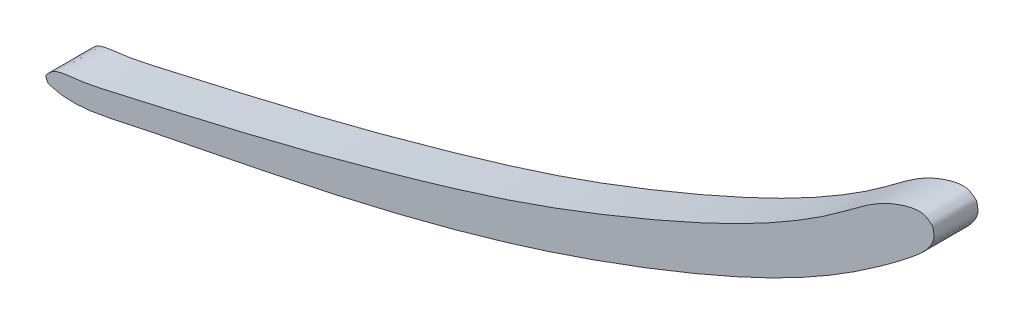
ISO-10303-21;
HEADER;
FILE_DESCRIPTION(('STEP AP214'),'2;1');
FILE_NAME('part.step','',(''),(''),'','','');
FILE_SCHEMA(('AUTOMOTIVE_DESIGN { 1 0 10303 214 1 1 1 1 }'));
ENDSEC;
DATA;
#1=APPLICATION_CONTEXT('core data for automotive mechanical design processes');
#2=APPLICATION_PROTOCOL_DEFINITION('international standard','automotive_design',2000,#1);
#3=PRODUCT_CONTEXT('',#1,'mechanical');
#4=PRODUCT('Part','Part','',(#3));
#5=PRODUCT_RELATED_PRODUCT_CATEGORY('part','',(#4));
#6=PRODUCT_DEFINITION_FORMATION('','',#4);
#7=PRODUCT_DEFINITION_CONTEXT('part definition',#1,'design');
#8=PRODUCT_DEFINITION('design','',#6,#7);
#9=PRODUCT_DEFINITION_SHAPE('','',#8);
#10=(LENGTH_UNIT() NAMED_UNIT(*) SI_UNIT(.MILLI.,.METRE.));
#11=(NAMED_UNIT(*) PLANE_ANGLE_UNIT() SI_UNIT($,.RADIAN.));
#12=(NAMED_UNIT(*) SI_UNIT($,.STERADIAN.) SOLID_ANGLE_UNIT());
#13=UNCERTAINTY_MEASURE_WITH_UNIT(LENGTH_MEASURE(1.E-05),#10,'distance_accuracy_value','');
#14=(GEOMETRIC_REPRESENTATION_CONTEXT(3) GLOBAL_UNCERTAINTY_ASSIGNED_CONTEXT((#13)) GLOBAL_UNIT_ASSIGNED_CONTEXT((#10,
#11,#12)) REPRESENTATION_CONTEXT('',''));
#15=CARTESIAN_POINT('',(0.,0.,0.));
#16=DIRECTION('',(0.,0.,1.));
#17=DIRECTION('',(1.,0.,0.));
#18=AXIS2_PLACEMENT_3D('',#15,#16,#17);
#19=CARTESIAN_POINT('',(93.8605540569844,0.,244.));
#20=CARTESIAN_POINT('',(93.8086791374924,0.104371023125291,244.));
#21=CARTESIAN_POINT('',(93.7224281105917,0.182551689222101,244.));
#22=CARTESIAN_POINT('',(93.5443834962592,0.328023369445167,244.));
#23=CARTESIAN_POINT('',(93.4510612065642,0.395126938248988,244.));
#24=CARTESIAN_POINT('',(93.2673724269745,0.533205688426143,244.));
#25=CARTESIAN_POINT('',(93.1767269560878,0.603815450492115,244.));
#26=CARTESIAN_POINT('',(92.9904425509646,0.738494357269943,244.));
#27=CARTESIAN_POINT('',(92.8950004810606,0.802614303495659,244.));
#28=CARTESIAN_POINT('',(92.6996064816065,0.920618631459439,244.));
#29=CARTESIAN_POINT('',(92.5993833129429,0.974506288392161,244.));
#30=CARTESIAN_POINT('',(92.3894918795378,1.06315896569431,244.));
#31=CARTESIAN_POINT('',(92.2791971709696,1.09851559198404,244.));
#32=CARTESIAN_POINT('',(91.9422006645801,1.17918113296887,244.));
#33=CARTESIAN_POINT('',(91.714825315123,1.19886813501814,244.));
#34=CARTESIAN_POINT('',(91.257409096839,1.20472416603272,244.));
#35=CARTESIAN_POINT('',(91.0267978015796,1.18991753782417,244.));
#36=CARTESIAN_POINT('',(90.5723191315177,1.14334518684298,244.));
#37=CARTESIAN_POINT('',(90.3470905185304,1.11111293580452,244.));
#38=CARTESIAN_POINT('',(89.6768006079999,0.99040869565579,244.));
#39=CARTESIAN_POINT('',(89.2367468012532,0.879657450637902,244.));
#40=CARTESIAN_POINT('',(88.3630772807734,0.629510689922901,244.));
#41=CARTESIAN_POINT('',(87.9286589973189,0.487991250829142,244.));
#42=CARTESIAN_POINT('',(87.0722296775301,0.178624810143415,244.));
#43=CARTESIAN_POINT('',(86.6508450465993,0.0116247730714919,244.));
#44=CARTESIAN_POINT('',(85.4056681441988,-0.523597171459055,244.));
#45=CARTESIAN_POINT('',(84.6014954480775,-0.927199706899777,244.));
#46=CARTESIAN_POINT('',(82.2641120259531,-2.27350013748435,244.));
#47=CARTESIAN_POINT('',(80.8004762480953,-3.34188406931883,244.));
#48=CARTESIAN_POINT('',(78.6196084356311,-4.96990224430101,244.));
#49=CARTESIAN_POINT('',(77.894138396885,-5.5151936531122,244.));
#50=CARTESIAN_POINT('',(76.4329174622362,-6.5876579317648,244.));
#51=CARTESIAN_POINT('',(75.6981806124208,-7.1166179126681,244.));
#52=CARTESIAN_POINT('',(73.4718001048386,-8.66442647793136,244.));
#53=CARTESIAN_POINT('',(71.9582511141489,-9.64467004889984,244.));
#54=CARTESIAN_POINT('',(68.8919897706839,-11.5361373716413,244.));
#55=CARTESIAN_POINT('',(67.3395127582724,-12.4477758771147,244.));
#56=CARTESIAN_POINT('',(64.2056538003671,-14.2201120814259,244.));
#57=CARTESIAN_POINT('',(62.6237737046291,-15.0799318617714,244.));
#58=CARTESIAN_POINT('',(59.4304687387369,-16.7475029870733,244.));
#59=CARTESIAN_POINT('',(57.8193963845281,-17.5558755909184,244.));
#60=CARTESIAN_POINT('',(54.574228193873,-19.1320452071202,244.));
#61=CARTESIAN_POINT('',(52.9402496624787,-19.9000489528382,244.));
#62=CARTESIAN_POINT('',(49.6563406051193,-21.4079433374709,244.));
#63=CARTESIAN_POINT('',(48.0059001632993,-22.1478013158492,244.));
#64=CARTESIAN_POINT('',(43.0356104304303,-24.3278315909944,244.));
#65=CARTESIAN_POINT('',(39.6993773155864,-25.7292600006737,244.));
#66=CARTESIAN_POINT('',(32.9930199195047,-28.4459399125709,244.));
#67=CARTESIAN_POINT('',(29.6232129384999,-29.7608437866351,244.));
#68=CARTESIAN_POINT('',(22.8413356340426,-32.2802520420894,244.));
#69=CARTESIAN_POINT('',(19.4267004740063,-33.4807706913742,244.));
#70=CARTESIAN_POINT('',(12.5595327127389,-35.7579846274792,244.));
#71=CARTESIAN_POINT('',(9.10665488269142,-36.8360789365154,244.));
#72=CARTESIAN_POINT('',(2.1758102595807,-38.9135796804014,244.));
#73=CARTESIAN_POINT('',(-1.30083218836211,-39.9164155500527,244.));
#74=CARTESIAN_POINT('',(-8.26539828335414,-41.8785611767772,244.));
#75=CARTESIAN_POINT('',(-11.7541409427858,-42.83653356265,244.));
#76=CARTESIAN_POINT('',(-18.7474275530531,-44.6959708243549,244.));
#77=CARTESIAN_POINT('',(-22.2514074112569,-45.5965908548554,244.));
#78=CARTESIAN_POINT('',(-29.2734558642128,-47.3415504678066,244.));
#79=CARTESIAN_POINT('',(-32.7915270610276,-48.1862340243107,244.));
#80=CARTESIAN_POINT('',(-39.8343566852922,-49.8474570856738,244.));
#81=CARTESIAN_POINT('',(-43.3588774014795,-50.6648724095137,244.));
#82=CARTESIAN_POINT('',(-48.6466114694081,-51.8867792112173,244.));
#83=CARTESIAN_POINT('',(-50.4095254910097,-52.2926265569602,244.));
#84=CARTESIAN_POINT('',(-53.0555067456765,-52.8943669274234,244.));
#85=CARTESIAN_POINT('',(-53.9377671329339,-53.0937623562211,244.));
#86=CARTESIAN_POINT('',(-55.7027865659835,-53.4903376135999,244.));
#87=CARTESIAN_POINT('',(-56.5850919298664,-53.6899882338138,244.));
#88=CARTESIAN_POINT('',(-58.3530400916118,-54.0720829512819,244.));
#89=CARTESIAN_POINT('',(-59.239187916362,-54.2516568759817,244.));
#90=CARTESIAN_POINT('',(-60.5762141506463,-54.4798241411653,244.));
#91=CARTESIAN_POINT('',(-61.0231386194551,-54.5493008888079,244.));
#92=CARTESIAN_POINT('',(-61.9196636445407,-54.6740706940748,244.));
#93=CARTESIAN_POINT('',(-62.3697209247039,-54.7268499625822,244.));
#94=CARTESIAN_POINT('',(-63.2707635620614,-54.827441411768,244.));
#95=CARTESIAN_POINT('',(-63.7211334340201,-54.8785476823985,244.));
#96=CARTESIAN_POINT('',(-64.3910076218556,-54.9856098868437,244.));
#97=CARTESIAN_POINT('',(-64.6133801142198,-55.0262152796553,244.));
#98=CARTESIAN_POINT('',(-65.055143030759,-55.1233861570706,244.));
#99=CARTESIAN_POINT('',(-65.2744793731547,-55.180241088496,244.));
#100=CARTESIAN_POINT('',(-65.5991706994857,-55.2886077547582,244.));
#101=CARTESIAN_POINT('',(-65.7066759953326,-55.3286109749291,244.));
#102=CARTESIAN_POINT('',(-65.9197572623547,-55.4189432015715,244.));
#103=CARTESIAN_POINT('',(-66.0261870965575,-55.4697772025274,244.));
#104=CARTESIAN_POINT('',(-66.3333127779153,-55.6378940397056,244.));
#105=CARTESIAN_POINT('',(-66.5203714127066,-55.7734439951672,244.));
#106=CARTESIAN_POINT('',(-66.8728940754668,-56.0731938702789,244.));
#107=CARTESIAN_POINT('',(-67.0383208032983,-56.2382814343258,244.));
#108=CARTESIAN_POINT('',(-67.2803413686867,-56.4907051810745,244.));
#109=CARTESIAN_POINT('',(-67.360273103681,-56.5767179163651,244.));
#110=CARTESIAN_POINT('',(-67.4549413420323,-56.7233693286972,244.));
#111=CARTESIAN_POINT('',(-67.4816210284276,-56.7762719237132,244.));
#112=CARTESIAN_POINT('',(-67.5140270938976,-56.8874267094301,244.));
#113=CARTESIAN_POINT('',(-67.519504630759,-56.9468099496123,244.));
#114=CARTESIAN_POINT('',(-67.5138245365627,-57.1205303650839,244.));
#115=CARTESIAN_POINT('',(-67.4826059788027,-57.2347260411175,244.));
#116=CARTESIAN_POINT('',(-67.4121359120193,-57.4555009410977,244.));
#117=CARTESIAN_POINT('',(-67.3717384764746,-57.564854992586,244.));
#118=CARTESIAN_POINT('',(-67.2906182186022,-57.7196552061633,244.));
#119=CARTESIAN_POINT('',(-67.2599502122451,-57.7688557724819,244.));
#120=CARTESIAN_POINT('',(-67.1843737133585,-57.8578382541536,244.));
#121=CARTESIAN_POINT('',(-67.1402626378147,-57.8967760250752,244.));
#122=CARTESIAN_POINT('',(-67.0419802643099,-57.9590083217347,244.));
#123=CARTESIAN_POINT('',(-66.9871980158439,-57.9815622036811,244.));
#124=CARTESIAN_POINT('',(-66.8769453565659,-58.0163227281835,244.));
#125=CARTESIAN_POINT('',(-66.8205775584039,-58.029426526502,244.));
#126=CARTESIAN_POINT('',(-66.650400097719,-58.0650381052503,244.));
#127=CARTESIAN_POINT('',(-66.5360715003173,-58.0856059033205,244.));
#128=CARTESIAN_POINT('',(-66.3096446199086,-58.1358671929452,244.));
#129=CARTESIAN_POINT('',(-66.1970180134791,-58.1635409483073,244.));
#130=CARTESIAN_POINT('',(-65.8595841654729,-58.2484948813967,244.));
#131=CARTESIAN_POINT('',(-65.6356485721547,-58.3095524454584,244.));
#132=CARTESIAN_POINT('',(-64.9579051687279,-58.4669981082381,244.));
#133=CARTESIAN_POINT('',(-64.4977928274511,-58.5307223184949,244.));
#134=CARTESIAN_POINT('',(-63.5832872386379,-58.6049190713349,244.));
#135=CARTESIAN_POINT('',(-63.1260518618479,-58.6190858099251,244.));
#136=CARTESIAN_POINT('',(-61.7543764058126,-58.6212008946451,244.));
#137=CARTESIAN_POINT('',(-60.8399741117111,-58.5594021799264,244.));
#138=CARTESIAN_POINT('',(-59.011237678737,-58.3460731268619,244.));
#139=CARTESIAN_POINT('',(-58.1034332960804,-58.1983011054739,244.));
#140=CARTESIAN_POINT('',(-56.2942398205783,-57.8707121697664,244.));
#141=CARTESIAN_POINT('',(-55.392897855504,-57.6885931028364,244.));
#142=CARTESIAN_POINT('',(-53.5919407800195,-57.3146326557679,244.));
#143=CARTESIAN_POINT('',(-52.6924959490929,-57.1224087886931,244.));
#144=CARTESIAN_POINT('',(-49.9946234271937,-56.5439722435562,244.));
#145=CARTESIAN_POINT('',(-48.1957773410412,-56.1596070566092,244.));
#146=CARTESIAN_POINT('',(-42.7931189994041,-55.0356571930698,244.));
#147=CARTESIAN_POINT('',(-39.1841954075797,-54.3206824403801,244.));
#148=CARTESIAN_POINT('',(-31.9666590390561,-52.8901306174075,244.));
#149=CARTESIAN_POINT('',(-28.3585295809253,-52.1717655145319,244.));
#150=CARTESIAN_POINT('',(-21.1528786400058,-50.6837299613315,244.));
#151=CARTESIAN_POINT('',(-17.554778064472,-49.9160463984074,244.));
#152=CARTESIAN_POINT('',(-10.3746160473152,-48.3065361313304,244.));
#153=CARTESIAN_POINT('',(-6.79333063695175,-47.4662260990448,244.));
#154=CARTESIAN_POINT('',(3.9192137548619,-44.8187225448935,244.));
#155=CARTESIAN_POINT('',(11.0223392878237,-42.8836129281505,244.));
#156=CARTESIAN_POINT('',(25.0890544185601,-38.5776042210642,244.));
#157=CARTESIAN_POINT('',(32.0556065834265,-36.1978043404435,244.));
#158=CARTESIAN_POINT('',(42.3912526645422,-32.3223696736165,244.));
#159=CARTESIAN_POINT('',(45.8158420581117,-30.9810729909033,244.));
#160=CARTESIAN_POINT('',(52.6089835127207,-28.191367401419,244.));
#161=CARTESIAN_POINT('',(55.9792691796525,-26.7431819441462,244.));
#162=CARTESIAN_POINT('',(62.6442371087069,-23.6934109301642,244.));
#163=CARTESIAN_POINT('',(65.9384768785694,-22.0909275520295,244.));
#164=CARTESIAN_POINT('',(72.4088633457205,-18.6463487158374,244.));
#165=CARTESIAN_POINT('',(75.5845213553748,-16.8032617054568,244.));
#166=CARTESIAN_POINT('',(80.2386777400822,-13.8167981980902,244.));
#167=CARTESIAN_POINT('',(81.7738828152785,-12.7841420823869,244.));
#168=CARTESIAN_POINT('',(84.8027433080683,-10.6570921754283,244.));
#169=CARTESIAN_POINT('',(86.2958264049976,-9.56320551191692,244.));
#170=CARTESIAN_POINT('',(88.5065254383957,-7.88430136121495,244.));
#171=CARTESIAN_POINT('',(89.2388903474007,-7.31842609918318,244.));
#172=CARTESIAN_POINT('',(90.3193553140982,-6.44716810348386,244.));
#173=CARTESIAN_POINT('',(90.6756304962373,-6.15218378749594,244.));
#174=CARTESIAN_POINT('',(91.3742524810901,-5.54582701188665,244.));
#175=CARTESIAN_POINT('',(91.7181421495188,-5.23465487872439,244.));
#176=CARTESIAN_POINT('',(92.37429189152,-4.58549341756893,244.));
#177=CARTESIAN_POINT('',(92.6864195851706,-4.24735196642919,244.));
#178=CARTESIAN_POINT('',(93.1138919046858,-3.7055141023747,244.));
#179=CARTESIAN_POINT('',(93.2494060471225,-3.51896888632089,244.));
#180=CARTESIAN_POINT('',(93.501311052493,-3.12961692755714,244.));
#181=CARTESIAN_POINT('',(93.6174857772522,-2.92615699043442,244.));
#182=CARTESIAN_POINT('',(93.8220788940639,-2.50939305326026,244.));
#183=CARTESIAN_POINT('',(93.9117701194868,-2.29535189710122,244.));
#184=CARTESIAN_POINT('',(94.0461015785027,-1.84704385862286,244.));
#185=CARTESIAN_POINT('',(94.0895697788212,-1.61917803752574,244.));
#186=CARTESIAN_POINT('',(94.0910725309282,-1.27067426780246,244.));
#187=CARTESIAN_POINT('',(94.0795016405934,-1.15264197988017,244.));
#188=CARTESIAN_POINT('',(94.04430288288,-0.920534515574776,244.));
#189=CARTESIAN_POINT('',(94.0204552340993,-0.805629278577837,244.));
#190=CARTESIAN_POINT('',(93.9751132842204,-0.575386235497547,244.));
#191=CARTESIAN_POINT('',(93.9572079337126,-0.459388744026412,244.));
#192=CARTESIAN_POINT('',(93.9330463257599,-0.284896877976952,244.));
#193=CARTESIAN_POINT('',(93.9255371178367,-0.226632808358534,244.));
#194=CARTESIAN_POINT('',(93.9086434400924,-0.140271530170307,244.));
#195=CARTESIAN_POINT('',(93.9019509773415,-0.111679503496059,244.));
#196=CARTESIAN_POINT('',(93.8846917055139,-0.0552075941555424,244.));
#197=CARTESIAN_POINT('',(93.8735227868573,-0.0260927557813124,244.));
#198=CARTESIAN_POINT('',(93.8605540569844,0.,244.));
#199=B_SPLINE_CURVE_WITH_KNOTS('',3,(#19,#20,#21,#22,#23,#24,#25,#26,#27,#28,#29,#30,#31,#32,
#33,#34,#35,#36,#37,#38,#39,#40,#41,#42,#43,#44,#45,#46,#47,#48,#49,#50,#51,#52,#53,#54,#55,#56,
#57,#58,#59,#60,#61,#62,#63,#64,#65,#66,#67,#68,#69,#70,#71,#72,#73,#74,#75,#76,#77,#78,#79,#80,
#81,#82,#83,#84,#85,#86,#87,#88,#89,#90,#91,#92,#93,#94,#95,#96,#97,#98,#99,#100,#101,#102,#103,
#104,#105,#106,#107,#108,#109,#110,#111,#112,#113,#114,#115,#116,#117,#118,#119,#120,#121,#122,
#123,#124,#125,#126,#127,#128,#129,#130,#131,#132,#133,#134,#135,#136,#137,#138,#139,#140,#141,
#142,#143,#144,#145,#146,#147,#148,#149,#150,#151,#152,#153,#154,#155,#156,#157,#158,#159,#160,
#161,#162,#163,#164,#165,#166,#167,#168,#169,#170,#171,#172,#173,#174,#175,#176,#177,#178,#179,
#180,#181,#182,#183,#184,#185,#186,#187,#188,#189,#190,#191,#192,#193,#194,#195,#196,#197,#198),
.UNSPECIFIED.,.T.,.F.,(4,2,2,2,2,2,2,2,2,2,2,2,2,2,2,2,2,2,2,2,2,2,2,2,2,2,2,2,2,2,2,2,2,2,2,2,
2,2,2,2,2,2,2,2,2,2,2,2,2,2,2,2,2,2,2,2,2,2,2,2,2,2,2,2,2,2,2,2,2,2,2,2,2,2,2,2,2,2,2,2,2,2,2,2,
2,2,2,2,2,4),(0.,0.000976562499999856,0.00195312499999971,0.00292968749999957,
0.00390624999999942,0.00488281249999928,0.00585937499999913,0.00781249999999896,
0.00976562499999879,0.0117187499999986,0.0156249999999984,0.0195312499999982,0.0234374999999979,
0.0312499999999973,0.0468749999999961,0.0546874999999955,0.0624999999999949,0.0781249999999936,
0.0937499999999923,0.109374999999991,0.12499999999999,0.140624999999989,0.156249999999987,
0.187499999999985,0.218749999999982,0.24999999999998,0.281249999999977,0.312499999999975,
0.343749999999972,0.37499999999997,0.406249999999967,0.437499999999965,0.453124999999964,
0.460937499999963,0.468749999999962,0.476562499999962,0.480468749999962,0.484374999999961,
0.488281249999961,0.490234374999961,0.492187499999961,0.49316406249996,0.49414062499996,
0.49609374999996,0.49804687499996,0.49902343749996,0.49951171874996,0.499999999999959,
0.500976562499959,0.501953124999959,0.502441406249959,0.502929687499959,0.503417968749959,
0.503906249999959,0.504882812499959,0.505859374999959,0.507812499999959,0.511718749999959,
0.51562499999996,0.52343749999996,0.531249999999961,0.539062499999962,0.546874999999962,
0.562499999999964,0.593749999999966,0.624999999999969,0.656249999999971,0.687499999999974,
0.749999999999979,0.812499999999984,0.843749999999987,0.87499999999999,0.906249999999992,
0.937499999999995,0.953124999999996,0.968749999999998,0.976562499999998,0.980468749999998,
0.984374999999999,0.988281249999999,0.990234374999999,0.992187499999999,0.994140625,0.99609375,
0.9970703125,0.998046875,0.9990234375,0.99951171875,0.999755859375,1.),.UNSPECIFIED.);
#200=DIRECTION('',(0.,0.,-1.));
#201=VECTOR('',#200,1.);
#202=SURFACE_OF_LINEAR_EXTRUSION('',#199,#201);
#203=CARTESIAN_POINT('',(93.8605540569844,0.,244.));
#204=CARTESIAN_POINT('',(93.8735227868573,-0.0260927557813124,244.));
#205=CARTESIAN_POINT('',(93.8846917055139,-0.0552075941555424,244.));
#206=CARTESIAN_POINT('',(93.9019509773415,-0.111679503496059,244.));
#207=CARTESIAN_POINT('',(93.9086434400924,-0.140271530170307,244.));
#208=CARTESIAN_POINT('',(93.9255371178367,-0.226632808358534,244.));
#209=CARTESIAN_POINT('',(93.9330463257599,-0.284896877976952,244.));
#210=CARTESIAN_POINT('',(93.9572079337126,-0.459388744026412,244.));
#211=CARTESIAN_POINT('',(93.9751132842204,-0.575386235497547,244.));
#212=CARTESIAN_POINT('',(94.0204552340993,-0.805629278577837,244.));
#213=CARTESIAN_POINT('',(94.04430288288,-0.920534515574776,244.));
#214=CARTESIAN_POINT('',(94.0795016405934,-1.15264197988017,244.));
#215=CARTESIAN_POINT('',(94.0910725309282,-1.27067426780246,244.));
#216=CARTESIAN_POINT('',(94.0895697788212,-1.61917803752574,244.));
#217=CARTESIAN_POINT('',(94.0461015785027,-1.84704385862286,244.));
#218=CARTESIAN_POINT('',(93.9117701194868,-2.29535189710122,244.));
#219=CARTESIAN_POINT('',(93.8220788940639,-2.50939305326026,244.));
#220=CARTESIAN_POINT('',(93.6174857772522,-2.92615699043442,244.));
#221=CARTESIAN_POINT('',(93.501311052493,-3.12961692755714,244.));
#222=CARTESIAN_POINT('',(93.2494060471225,-3.51896888632089,244.));
#223=CARTESIAN_POINT('',(93.1138919046858,-3.7055141023747,244.));
#224=CARTESIAN_POINT('',(92.6864195851706,-4.24735196642919,244.));
#225=CARTESIAN_POINT('',(92.37429189152,-4.58549341756893,244.));
#226=CARTESIAN_POINT('',(91.7181421495188,-5.23465487872439,244.));
#227=CARTESIAN_POINT('',(91.3742524810901,-5.54582701188665,244.));
#228=CARTESIAN_POINT('',(90.6756304962373,-6.15218378749594,244.));
#229=CARTESIAN_POINT('',(90.3193553140982,-6.44716810348386,244.));
#230=CARTESIAN_POINT('',(89.2388903474007,-7.31842609918318,244.));
#231=CARTESIAN_POINT('',(88.5065254383957,-7.88430136121495,244.));
#232=CARTESIAN_POINT('',(86.2958264049976,-9.56320551191692,244.));
#233=CARTESIAN_POINT('',(84.8027433080683,-10.6570921754283,244.));
#234=CARTESIAN_POINT('',(81.7738828152785,-12.7841420823869,244.));
#235=CARTESIAN_POINT('',(80.2386777400822,-13.8167981980902,244.));
#236=CARTESIAN_POINT('',(75.5845213553748,-16.8032617054568,244.));
#237=CARTESIAN_POINT('',(72.4088633457205,-18.6463487158374,244.));
#238=CARTESIAN_POINT('',(65.9384768785694,-22.0909275520295,244.));
#239=CARTESIAN_POINT('',(62.6442371087069,-23.6934109301642,244.));
#240=CARTESIAN_POINT('',(55.9792691796525,-26.7431819441462,244.));
#241=CARTESIAN_POINT('',(52.6089835127207,-28.191367401419,244.));
#242=CARTESIAN_POINT('',(45.8158420581117,-30.9810729909033,244.));
#243=CARTESIAN_POINT('',(42.3912526645422,-32.3223696736165,244.));
#244=CARTESIAN_POINT('',(32.0556065834265,-36.1978043404435,244.));
#245=CARTESIAN_POINT('',(25.0890544185601,-38.5776042210642,244.));
#246=CARTESIAN_POINT('',(11.0223392878237,-42.8836129281505,244.));
#247=CARTESIAN_POINT('',(3.9192137548619,-44.8187225448935,244.));
#248=CARTESIAN_POINT('',(-6.79333063695175,-47.4662260990448,244.));
#249=CARTESIAN_POINT('',(-10.3746160473152,-48.3065361313304,244.));
#250=CARTESIAN_POINT('',(-17.554778064472,-49.9160463984074,244.));
#251=CARTESIAN_POINT('',(-21.1528786400058,-50.6837299613315,244.));
#252=CARTESIAN_POINT('',(-28.3585295809253,-52.1717655145319,244.));
#253=CARTESIAN_POINT('',(-31.9666590390561,-52.8901306174075,244.));
#254=CARTESIAN_POINT('',(-39.1841954075797,-54.3206824403801,244.));
#255=CARTESIAN_POINT('',(-42.7931189994041,-55.0356571930698,244.));
#256=CARTESIAN_POINT('',(-48.1957773410412,-56.1596070566092,244.));
#257=CARTESIAN_POINT('',(-49.9946234271937,-56.5439722435562,244.));
#258=CARTESIAN_POINT('',(-52.6924959490929,-57.1224087886931,244.));
#259=CARTESIAN_POINT('',(-53.5919407800195,-57.3146326557679,244.));
#260=CARTESIAN_POINT('',(-55.392897855504,-57.6885931028364,244.));
#261=CARTESIAN_POINT('',(-56.2942398205783,-57.8707121697664,244.));
#262=CARTESIAN_POINT('',(-58.1034332960804,-58.1983011054739,244.));
#263=CARTESIAN_POINT('',(-59.011237678737,-58.3460731268619,244.));
#264=CARTESIAN_POINT('',(-60.8399741117111,-58.5594021799264,244.));
#265=CARTESIAN_POINT('',(-61.7543764058126,-58.6212008946451,244.));
#266=CARTESIAN_POINT('',(-63.1260518618479,-58.6190858099251,244.));
#267=CARTESIAN_POINT('',(-63.5832872386379,-58.6049190713349,244.));
#268=CARTESIAN_POINT('',(-64.4977928274511,-58.5307223184949,244.));
#269=CARTESIAN_POINT('',(-64.9579051687279,-58.4669981082381,244.));
#270=CARTESIAN_POINT('',(-65.6356485721547,-58.3095524454584,244.));
#271=CARTESIAN_POINT('',(-65.8595841654729,-58.2484948813967,244.));
#272=CARTESIAN_POINT('',(-66.1970180134791,-58.1635409483073,244.));
#273=CARTESIAN_POINT('',(-66.3096446199086,-58.1358671929452,244.));
#274=CARTESIAN_POINT('',(-66.5360715003173,-58.0856059033205,244.));
#275=CARTESIAN_POINT('',(-66.650400097719,-58.0650381052503,244.));
#276=CARTESIAN_POINT('',(-66.8205775584039,-58.029426526502,244.));
#277=CARTESIAN_POINT('',(-66.8769453565659,-58.0163227281835,244.));
#278=CARTESIAN_POINT('',(-66.9871980158439,-57.9815622036811,244.));
#279=CARTESIAN_POINT('',(-67.0419802643099,-57.9590083217347,244.));
#280=CARTESIAN_POINT('',(-67.1402626378147,-57.8967760250752,244.));
#281=CARTESIAN_POINT('',(-67.1843737133585,-57.8578382541536,244.));
#282=CARTESIAN_POINT('',(-67.2599502122451,-57.7688557724819,244.));
#283=CARTESIAN_POINT('',(-67.2906182186022,-57.7196552061633,244.));
#284=CARTESIAN_POINT('',(-67.3717384764746,-57.564854992586,244.));
#285=CARTESIAN_POINT('',(-67.4121359120193,-57.4555009410977,244.));
#286=CARTESIAN_POINT('',(-67.4826059788027,-57.2347260411175,244.));
#287=CARTESIAN_POINT('',(-67.5138245365627,-57.1205303650839,244.));
#288=CARTESIAN_POINT('',(-67.519504630759,-56.9468099496123,244.));
#289=CARTESIAN_POINT('',(-67.5140270938976,-56.8874267094301,244.));
#290=CARTESIAN_POINT('',(-67.4816210284276,-56.7762719237132,244.));
#291=CARTESIAN_POINT('',(-67.4549413420323,-56.7233693286972,244.));
#292=CARTESIAN_POINT('',(-67.360273103681,-56.5767179163651,244.));
#293=CARTESIAN_POINT('',(-67.2803413686867,-56.4907051810745,244.));
#294=CARTESIAN_POINT('',(-67.0383208032983,-56.2382814343258,244.));
#295=CARTESIAN_POINT('',(-66.8728940754668,-56.0731938702789,244.));
#296=CARTESIAN_POINT('',(-66.5203714127066,-55.7734439951672,244.));
#297=CARTESIAN_POINT('',(-66.3333127779153,-55.6378940397056,244.));
#298=CARTESIAN_POINT('',(-66.0261870965575,-55.4697772025274,244.));
#299=CARTESIAN_POINT('',(-65.9197572623547,-55.4189432015715,244.));
#300=CARTESIAN_POINT('',(-65.7066759953326,-55.3286109749291,244.));
#301=CARTESIAN_POINT('',(-65.5991706994857,-55.2886077547582,244.));
#302=CARTESIAN_POINT('',(-65.2744793731547,-55.180241088496,244.));
#303=CARTESIAN_POINT('',(-65.055143030759,-55.1233861570706,244.));
#304=CARTESIAN_POINT('',(-64.6133801142198,-55.0262152796553,244.));
#305=CARTESIAN_POINT('',(-64.3910076218556,-54.9856098868437,244.));
#306=CARTESIAN_POINT('',(-63.7211334340201,-54.8785476823985,244.));
#307=CARTESIAN_POINT('',(-63.2707635620614,-54.827441411768,244.));
#308=CARTESIAN_POINT('',(-62.3697209247039,-54.7268499625822,244.));
#309=CARTESIAN_POINT('',(-61.9196636445407,-54.6740706940748,244.));
#310=CARTESIAN_POINT('',(-61.0231386194551,-54.5493008888079,244.));
#311=CARTESIAN_POINT('',(-60.5762141506463,-54.4798241411653,244.));
#312=CARTESIAN_POINT('',(-59.239187916362,-54.2516568759817,244.));
#313=CARTESIAN_POINT('',(-58.3530400916118,-54.0720829512819,244.));
#314=CARTESIAN_POINT('',(-56.5850919298664,-53.6899882338138,244.));
#315=CARTESIAN_POINT('',(-55.7027865659835,-53.4903376135999,244.));
#316=CARTESIAN_POINT('',(-53.9377671329339,-53.0937623562211,244.));
#317=CARTESIAN_POINT('',(-53.0555067456765,-52.8943669274234,244.));
#318=CARTESIAN_POINT('',(-50.4095254910097,-52.2926265569602,244.));
#319=CARTESIAN_POINT('',(-48.6466114694081,-51.8867792112173,244.));
#320=CARTESIAN_POINT('',(-43.3588774014795,-50.6648724095137,244.));
#321=CARTESIAN_POINT('',(-39.8343566852922,-49.8474570856738,244.));
#322=CARTESIAN_POINT('',(-32.7915270610276,-48.1862340243107,244.));
#323=CARTESIAN_POINT('',(-29.2734558642128,-47.3415504678066,244.));
#324=CARTESIAN_POINT('',(-22.2514074112569,-45.5965908548554,244.));
#325=CARTESIAN_POINT('',(-18.7474275530531,-44.6959708243549,244.));
#326=CARTESIAN_POINT('',(-11.7541409427858,-42.83653356265,244.));
#327=CARTESIAN_POINT('',(-8.26539828335414,-41.8785611767772,244.));
#328=CARTESIAN_POINT('',(-1.30083218836211,-39.9164155500527,244.));
#329=CARTESIAN_POINT('',(2.1758102595807,-38.9135796804014,244.));
#330=CARTESIAN_POINT('',(9.10665488269142,-36.8360789365154,244.));
#331=CARTESIAN_POINT('',(12.5595327127389,-35.7579846274792,244.));
#332=CARTESIAN_POINT('',(19.4267004740063,-33.4807706913742,244.));
#333=CARTESIAN_POINT('',(22.8413356340426,-32.2802520420894,244.));
#334=CARTESIAN_POINT('',(29.6232129384999,-29.7608437866351,244.));
#335=CARTESIAN_POINT('',(32.9930199195047,-28.4459399125709,244.));
#336=CARTESIAN_POINT('',(39.6993773155864,-25.7292600006737,244.));
#337=CARTESIAN_POINT('',(43.0356104304303,-24.3278315909944,244.));
#338=CARTESIAN_POINT('',(48.0059001632993,-22.1478013158492,244.));
#339=CARTESIAN_POINT('',(49.6563406051193,-21.4079433374709,244.));
#340=CARTESIAN_POINT('',(52.9402496624787,-19.9000489528382,244.));
#341=CARTESIAN_POINT('',(54.574228193873,-19.1320452071202,244.));
#342=CARTESIAN_POINT('',(57.8193963845281,-17.5558755909184,244.));
#343=CARTESIAN_POINT('',(59.4304687387369,-16.7475029870733,244.));
#344=CARTESIAN_POINT('',(62.6237737046291,-15.0799318617714,244.));
#345=CARTESIAN_POINT('',(64.2056538003671,-14.2201120814259,244.));
#346=CARTESIAN_POINT('',(67.3395127582724,-12.4477758771147,244.));
#347=CARTESIAN_POINT('',(68.8919897706839,-11.5361373716413,244.));
#348=CARTESIAN_POINT('',(71.9582511141489,-9.64467004889984,244.));
#349=CARTESIAN_POINT('',(73.4718001048386,-8.66442647793136,244.));
#350=CARTESIAN_POINT('',(75.6981806124208,-7.1166179126681,244.));
#351=CARTESIAN_POINT('',(76.4329174622362,-6.5876579317648,244.));
#352=CARTESIAN_POINT('',(77.894138396885,-5.5151936531122,244.));
#353=CARTESIAN_POINT('',(78.6196084356311,-4.96990224430101,244.));
#354=CARTESIAN_POINT('',(80.8004762480953,-3.34188406931883,244.));
#355=CARTESIAN_POINT('',(82.2641120259531,-2.27350013748435,244.));
#356=CARTESIAN_POINT('',(84.6014954480775,-0.927199706899777,244.));
#357=CARTESIAN_POINT('',(85.4056681441988,-0.523597171459055,244.));
#358=CARTESIAN_POINT('',(86.6508450465993,0.0116247730714919,244.));
#359=CARTESIAN_POINT('',(87.0722296775301,0.178624810143415,244.));
#360=CARTESIAN_POINT('',(87.9286589973189,0.487991250829142,244.));
#361=CARTESIAN_POINT('',(88.3630772807734,0.629510689922901,244.));
#362=CARTESIAN_POINT('',(89.2367468012532,0.879657450637902,244.));
#363=CARTESIAN_POINT('',(89.6768006079999,0.99040869565579,244.));
#364=CARTESIAN_POINT('',(90.3470905185304,1.11111293580452,244.));
#365=CARTESIAN_POINT('',(90.5723191315177,1.14334518684298,244.));
#366=CARTESIAN_POINT('',(91.0267978015796,1.18991753782417,244.));
#367=CARTESIAN_POINT('',(91.257409096839,1.20472416603272,244.));
#368=CARTESIAN_POINT('',(91.714825315123,1.19886813501814,244.));
#369=CARTESIAN_POINT('',(91.9422006645801,1.17918113296887,244.));
#370=CARTESIAN_POINT('',(92.2791971709696,1.09851559198404,244.));
#371=CARTESIAN_POINT('',(92.3894918795378,1.06315896569431,244.));
#372=CARTESIAN_POINT('',(92.5993833129429,0.974506288392161,244.));
#373=CARTESIAN_POINT('',(92.6996064816065,0.920618631459439,244.));
#374=CARTESIAN_POINT('',(92.8950004810606,0.802614303495659,244.));
#375=CARTESIAN_POINT('',(92.9904425509646,0.738494357269943,244.));
#376=CARTESIAN_POINT('',(93.1767269560878,0.603815450492115,244.));
#377=CARTESIAN_POINT('',(93.2673724269745,0.533205688426143,244.));
#378=CARTESIAN_POINT('',(93.4510612065642,0.395126938248988,244.));
#379=CARTESIAN_POINT('',(93.5443834962592,0.328023369445167,244.));
#380=CARTESIAN_POINT('',(93.7224281105917,0.182551689222101,244.));
#381=CARTESIAN_POINT('',(93.8086791374924,0.104371023125291,244.));
#382=CARTESIAN_POINT('',(93.8605540569844,0.,244.));
#383=B_SPLINE_CURVE_WITH_KNOTS('',3,(#203,#204,#205,#206,#207,#208,#209,#210,#211,#212,#213,
#214,#215,#216,#217,#218,#219,#220,#221,#222,#223,#224,#225,#226,#227,#228,#229,#230,#231,#232,
#233,#234,#235,#236,#237,#238,#239,#240,#241,#242,#243,#244,#245,#246,#247,#248,#249,#250,#251,
#252,#253,#254,#255,#256,#257,#258,#259,#260,#261,#262,#263,#264,#265,#266,#267,#268,#269,#270,
#271,#272,#273,#274,#275,#276,#277,#278,#279,#280,#281,#282,#283,#284,#285,#286,#287,#288,#289,
#290,#291,#292,#293,#294,#295,#296,#297,#298,#299,#300,#301,#302,#303,#304,#305,#306,#307,#308,
#309,#310,#311,#312,#313,#314,#315,#316,#317,#318,#319,#320,#321,#322,#323,#324,#325,#326,#327,
#328,#329,#330,#331,#332,#333,#334,#335,#336,#337,#338,#339,#340,#341,#342,#343,#344,#345,#346,
#347,#348,#349,#350,#351,#352,#353,#354,#355,#356,#357,#358,#359,#360,#361,#362,#363,#364,#365,
#366,#367,#368,#369,#370,#371,#372,#373,#374,#375,#376,#377,#378,#379,#380,#381,#382),
.UNSPECIFIED.,.T.,.F.,(4,2,2,2,2,2,2,2,2,2,2,2,2,2,2,2,2,2,2,2,2,2,2,2,2,2,2,2,2,2,2,2,2,2,2,2,
2,2,2,2,2,2,2,2,2,2,2,2,2,2,2,2,2,2,2,2,2,2,2,2,2,2,2,2,2,2,2,2,2,2,2,2,2,2,2,2,2,2,2,2,2,2,2,2,
2,2,2,2,2,4),(0.,0.000244140625000111,0.00048828125,0.000976562500000111,0.00195312500000011,
0.00292968750000022,0.00390625000000033,0.00585937500000044,0.00781250000000067,
0.00976562500000078,0.0117187500000009,0.0156250000000012,0.0195312500000016,0.0234375000000019,
0.0312500000000024,0.0468750000000039,0.0625000000000052,0.0937500000000078,0.12500000000001,
0.156250000000013,0.187500000000016,0.250000000000021,0.312500000000026,0.343750000000029,
0.375000000000031,0.406250000000034,0.437500000000036,0.453125000000038,0.460937500000038,
0.468750000000039,0.47656250000004,0.48437500000004,0.488281250000041,0.492187500000041,
0.494140625000041,0.495117187500041,0.496093750000041,0.496582031250041,0.497070312500041,
0.497558593750041,0.498046875000041,0.499023437500041,0.500000000000041,0.50048828125004,
0.50097656250004,0.50195312500004,0.50390625000004,0.50585937500004,0.50683593750004,
0.507812500000039,0.509765625000039,0.511718750000039,0.515625000000039,0.519531250000038,
0.523437500000038,0.531250000000038,0.539062500000037,0.546875000000036,0.562500000000035,
0.593750000000033,0.62500000000003,0.656250000000028,0.687500000000025,0.718750000000023,
0.75000000000002,0.781250000000018,0.812500000000015,0.843750000000013,0.859375000000011,
0.87500000000001,0.890625000000009,0.906250000000008,0.921875000000006,0.937500000000005,
0.945312500000005,0.953125000000004,0.968750000000003,0.976562500000002,0.980468750000002,
0.984375000000002,0.988281250000001,0.990234375000001,0.992187500000001,0.994140625000001,
0.995117187500001,0.996093750000001,0.9970703125,0.998046875,0.9990234375,1.),.UNSPECIFIED.);
#384=CARTESIAN_POINT('',(93.8605540569844,0.,244.));
#385=VERTEX_POINT('',#384);
#386=EDGE_CURVE('E10',#385,#385,#383,.F.);
#387=ORIENTED_EDGE('',*,*,#386,.F.);
#388=EDGE_LOOP('',(#387));
#389=FACE_BOUND('',#388,.T.);
#390=CARTESIAN_POINT('',(93.8605540569844,0.,236.));
#391=CARTESIAN_POINT('',(93.8086791374924,0.104371023125291,236.));
#392=CARTESIAN_POINT('',(93.7224281105917,0.182551689222101,236.));
#393=CARTESIAN_POINT('',(93.5443834962592,0.328023369445167,236.));
#394=CARTESIAN_POINT('',(93.4510612065642,0.395126938248988,236.));
#395=CARTESIAN_POINT('',(93.2673724269745,0.533205688426143,236.));
#396=CARTESIAN_POINT('',(93.1767269560878,0.603815450492115,236.));
#397=CARTESIAN_POINT('',(92.9904425509646,0.738494357269943,236.));
#398=CARTESIAN_POINT('',(92.8950004810606,0.802614303495659,236.));
#399=CARTESIAN_POINT('',(92.6996064816065,0.920618631459439,236.));
#400=CARTESIAN_POINT('',(92.5993833129429,0.974506288392161,236.));
#401=CARTESIAN_POINT('',(92.3894918795378,1.06315896569431,236.));
#402=CARTESIAN_POINT('',(92.2791971709696,1.09851559198404,236.));
#403=CARTESIAN_POINT('',(91.9422006645801,1.17918113296887,236.));
#404=CARTESIAN_POINT('',(91.714825315123,1.19886813501814,236.));
#405=CARTESIAN_POINT('',(91.257409096839,1.20472416603272,236.));
#406=CARTESIAN_POINT('',(91.0267978015796,1.18991753782417,236.));
#407=CARTESIAN_POINT('',(90.5723191315177,1.14334518684298,236.));
#408=CARTESIAN_POINT('',(90.3470905185304,1.11111293580452,236.));
#409=CARTESIAN_POINT('',(89.6768006079999,0.99040869565579,236.));
#410=CARTESIAN_POINT('',(89.2367468012532,0.879657450637902,236.));
#411=CARTESIAN_POINT('',(88.3630772807734,0.629510689922901,236.));
#412=CARTESIAN_POINT('',(87.9286589973189,0.487991250829142,236.));
#413=CARTESIAN_POINT('',(87.0722296775301,0.178624810143415,236.));
#414=CARTESIAN_POINT('',(86.6508450465993,0.0116247730714919,236.));
#415=CARTESIAN_POINT('',(85.4056681441988,-0.523597171459055,236.));
#416=CARTESIAN_POINT('',(84.6014954480775,-0.927199706899777,236.));
#417=CARTESIAN_POINT('',(82.2641120259531,-2.27350013748435,236.));
#418=CARTESIAN_POINT('',(80.8004762480953,-3.34188406931883,236.));
#419=CARTESIAN_POINT('',(78.6196084356311,-4.96990224430101,236.));
#420=CARTESIAN_POINT('',(77.894138396885,-5.5151936531122,236.));
#421=CARTESIAN_POINT('',(76.4329174622362,-6.5876579317648,236.));
#422=CARTESIAN_POINT('',(75.6981806124208,-7.1166179126681,236.));
#423=CARTESIAN_POINT('',(73.4718001048386,-8.66442647793136,236.));
#424=CARTESIAN_POINT('',(71.9582511141489,-9.64467004889984,236.));
#425=CARTESIAN_POINT('',(68.8919897706839,-11.5361373716413,236.));
#426=CARTESIAN_POINT('',(67.3395127582724,-12.4477758771147,236.));
#427=CARTESIAN_POINT('',(64.2056538003671,-14.2201120814259,236.));
#428=CARTESIAN_POINT('',(62.6237737046291,-15.0799318617714,236.));
#429=CARTESIAN_POINT('',(59.4304687387369,-16.7475029870733,236.));
#430=CARTESIAN_POINT('',(57.8193963845281,-17.5558755909184,236.));
#431=CARTESIAN_POINT('',(54.574228193873,-19.1320452071202,236.));
#432=CARTESIAN_POINT('',(52.9402496624787,-19.9000489528382,236.));
#433=CARTESIAN_POINT('',(49.6563406051193,-21.4079433374709,236.));
#434=CARTESIAN_POINT('',(48.0059001632993,-22.1478013158492,236.));
#435=CARTESIAN_POINT('',(43.0356104304303,-24.3278315909944,236.));
#436=CARTESIAN_POINT('',(39.6993773155864,-25.7292600006737,236.));
#437=CARTESIAN_POINT('',(32.9930199195047,-28.4459399125709,236.));
#438=CARTESIAN_POINT('',(29.6232129384999,-29.7608437866351,236.));
#439=CARTESIAN_POINT('',(22.8413356340426,-32.2802520420894,236.));
#440=CARTESIAN_POINT('',(19.4267004740063,-33.4807706913742,236.));
#441=CARTESIAN_POINT('',(12.5595327127389,-35.7579846274792,236.));
#442=CARTESIAN_POINT('',(9.10665488269142,-36.8360789365154,236.));
#443=CARTESIAN_POINT('',(2.1758102595807,-38.9135796804014,236.));
#444=CARTESIAN_POINT('',(-1.30083218836211,-39.9164155500527,236.));
#445=CARTESIAN_POINT('',(-8.26539828335414,-41.8785611767772,236.));
#446=CARTESIAN_POINT('',(-11.7541409427858,-42.83653356265,236.));
#447=CARTESIAN_POINT('',(-18.7474275530531,-44.6959708243549,236.));
#448=CARTESIAN_POINT('',(-22.2514074112569,-45.5965908548554,236.));
#449=CARTESIAN_POINT('',(-29.2734558642128,-47.3415504678066,236.));
#450=CARTESIAN_POINT('',(-32.7915270610276,-48.1862340243107,236.));
#451=CARTESIAN_POINT('',(-39.8343566852922,-49.8474570856738,236.));
#452=CARTESIAN_POINT('',(-43.3588774014795,-50.6648724095137,236.));
#453=CARTESIAN_POINT('',(-48.6466114694081,-51.8867792112173,236.));
#454=CARTESIAN_POINT('',(-50.4095254910097,-52.2926265569602,236.));
#455=CARTESIAN_POINT('',(-53.0555067456765,-52.8943669274234,236.));
#456=CARTESIAN_POINT('',(-53.9377671329339,-53.0937623562211,236.));
#457=CARTESIAN_POINT('',(-55.7027865659835,-53.4903376135999,236.));
#458=CARTESIAN_POINT('',(-56.5850919298664,-53.6899882338138,236.));
#459=CARTESIAN_POINT('',(-58.3530400916118,-54.0720829512819,236.));
#460=CARTESIAN_POINT('',(-59.239187916362,-54.2516568759817,236.));
#461=CARTESIAN_POINT('',(-60.5762141506463,-54.4798241411653,236.));
#462=CARTESIAN_POINT('',(-61.0231386194551,-54.5493008888079,236.));
#463=CARTESIAN_POINT('',(-61.9196636445407,-54.6740706940748,236.));
#464=CARTESIAN_POINT('',(-62.3697209247039,-54.7268499625822,236.));
#465=CARTESIAN_POINT('',(-63.2707635620614,-54.827441411768,236.));
#466=CARTESIAN_POINT('',(-63.7211334340201,-54.8785476823985,236.));
#467=CARTESIAN_POINT('',(-64.3910076218556,-54.9856098868437,236.));
#468=CARTESIAN_POINT('',(-64.6133801142198,-55.0262152796553,236.));
#469=CARTESIAN_POINT('',(-65.055143030759,-55.1233861570706,236.));
#470=CARTESIAN_POINT('',(-65.2744793731547,-55.180241088496,236.));
#471=CARTESIAN_POINT('',(-65.5991706994857,-55.2886077547582,236.));
#472=CARTESIAN_POINT('',(-65.7066759953326,-55.3286109749291,236.));
#473=CARTESIAN_POINT('',(-65.9197572623547,-55.4189432015715,236.));
#474=CARTESIAN_POINT('',(-66.0261870965575,-55.4697772025274,236.));
#475=CARTESIAN_POINT('',(-66.3333127779153,-55.6378940397056,236.));
#476=CARTESIAN_POINT('',(-66.5203714127066,-55.7734439951672,236.));
#477=CARTESIAN_POINT('',(-66.8728940754668,-56.0731938702789,236.));
#478=CARTESIAN_POINT('',(-67.0383208032983,-56.2382814343258,236.));
#479=CARTESIAN_POINT('',(-67.2803413686867,-56.4907051810745,236.));
#480=CARTESIAN_POINT('',(-67.360273103681,-56.5767179163651,236.));
#481=CARTESIAN_POINT('',(-67.4549413420323,-56.7233693286972,236.));
#482=CARTESIAN_POINT('',(-67.4816210284276,-56.7762719237132,236.));
#483=CARTESIAN_POINT('',(-67.5140270938976,-56.8874267094301,236.));
#484=CARTESIAN_POINT('',(-67.519504630759,-56.9468099496123,236.));
#485=CARTESIAN_POINT('',(-67.5138245365627,-57.1205303650839,236.));
#486=CARTESIAN_POINT('',(-67.4826059788027,-57.2347260411175,236.));
#487=CARTESIAN_POINT('',(-67.4121359120193,-57.4555009410977,236.));
#488=CARTESIAN_POINT('',(-67.3717384764746,-57.564854992586,236.));
#489=CARTESIAN_POINT('',(-67.2906182186022,-57.7196552061633,236.));
#490=CARTESIAN_POINT('',(-67.2599502122451,-57.7688557724819,236.));
#491=CARTESIAN_POINT('',(-67.1843737133585,-57.8578382541536,236.));
#492=CARTESIAN_POINT('',(-67.1402626378147,-57.8967760250752,236.));
#493=CARTESIAN_POINT('',(-67.0419802643099,-57.9590083217347,236.));
#494=CARTESIAN_POINT('',(-66.9871980158439,-57.9815622036811,236.));
#495=CARTESIAN_POINT('',(-66.8769453565659,-58.0163227281835,236.));
#496=CARTESIAN_POINT('',(-66.8205775584039,-58.029426526502,236.));
#497=CARTESIAN_POINT('',(-66.650400097719,-58.0650381052503,236.));
#498=CARTESIAN_POINT('',(-66.5360715003173,-58.0856059033205,236.));
#499=CARTESIAN_POINT('',(-66.3096446199086,-58.1358671929452,236.));
#500=CARTESIAN_POINT('',(-66.1970180134791,-58.1635409483073,236.));
#501=CARTESIAN_POINT('',(-65.8595841654729,-58.2484948813967,236.));
#502=CARTESIAN_POINT('',(-65.6356485721547,-58.3095524454584,236.));
#503=CARTESIAN_POINT('',(-64.9579051687279,-58.4669981082381,236.));
#504=CARTESIAN_POINT('',(-64.4977928274511,-58.5307223184949,236.));
#505=CARTESIAN_POINT('',(-63.5832872386379,-58.6049190713349,236.));
#506=CARTESIAN_POINT('',(-63.1260518618479,-58.6190858099251,236.));
#507=CARTESIAN_POINT('',(-61.7543764058126,-58.6212008946451,236.));
#508=CARTESIAN_POINT('',(-60.8399741117111,-58.5594021799264,236.));
#509=CARTESIAN_POINT('',(-59.011237678737,-58.3460731268619,236.));
#510=CARTESIAN_POINT('',(-58.1034332960804,-58.1983011054739,236.));
#511=CARTESIAN_POINT('',(-56.2942398205783,-57.8707121697664,236.));
#512=CARTESIAN_POINT('',(-55.392897855504,-57.6885931028364,236.));
#513=CARTESIAN_POINT('',(-53.5919407800195,-57.3146326557679,236.));
#514=CARTESIAN_POINT('',(-52.6924959490929,-57.1224087886931,236.));
#515=CARTESIAN_POINT('',(-49.9946234271937,-56.5439722435562,236.));
#516=CARTESIAN_POINT('',(-48.1957773410412,-56.1596070566092,236.));
#517=CARTESIAN_POINT('',(-42.7931189994041,-55.0356571930698,236.));
#518=CARTESIAN_POINT('',(-39.1841954075797,-54.3206824403801,236.));
#519=CARTESIAN_POINT('',(-31.9666590390561,-52.8901306174075,236.));
#520=CARTESIAN_POINT('',(-28.3585295809253,-52.1717655145319,236.));
#521=CARTESIAN_POINT('',(-21.1528786400058,-50.6837299613315,236.));
#522=CARTESIAN_POINT('',(-17.554778064472,-49.9160463984074,236.));
#523=CARTESIAN_POINT('',(-10.3746160473152,-48.3065361313304,236.));
#524=CARTESIAN_POINT('',(-6.79333063695175,-47.4662260990448,236.));
#525=CARTESIAN_POINT('',(3.9192137548619,-44.8187225448935,236.));
#526=CARTESIAN_POINT('',(11.0223392878237,-42.8836129281505,236.));
#527=CARTESIAN_POINT('',(25.0890544185601,-38.5776042210642,236.));
#528=CARTESIAN_POINT('',(32.0556065834265,-36.1978043404435,236.));
#529=CARTESIAN_POINT('',(42.3912526645422,-32.3223696736165,236.));
#530=CARTESIAN_POINT('',(45.8158420581117,-30.9810729909033,236.));
#531=CARTESIAN_POINT('',(52.6089835127207,-28.191367401419,236.));
#532=CARTESIAN_POINT('',(55.9792691796525,-26.7431819441462,236.));
#533=CARTESIAN_POINT('',(62.6442371087069,-23.6934109301642,236.));
#534=CARTESIAN_POINT('',(65.9384768785694,-22.0909275520295,236.));
#535=CARTESIAN_POINT('',(72.4088633457205,-18.6463487158374,236.));
#536=CARTESIAN_POINT('',(75.5845213553748,-16.8032617054568,236.));
#537=CARTESIAN_POINT('',(80.2386777400822,-13.8167981980902,236.));
#538=CARTESIAN_POINT('',(81.7738828152785,-12.7841420823869,236.));
#539=CARTESIAN_POINT('',(84.8027433080683,-10.6570921754283,236.));
#540=CARTESIAN_POINT('',(86.2958264049976,-9.56320551191692,236.));
#541=CARTESIAN_POINT('',(88.5065254383957,-7.88430136121495,236.));
#542=CARTESIAN_POINT('',(89.2388903474007,-7.31842609918318,236.));
#543=CARTESIAN_POINT('',(90.3193553140982,-6.44716810348386,236.));
#544=CARTESIAN_POINT('',(90.6756304962373,-6.15218378749594,236.));
#545=CARTESIAN_POINT('',(91.3742524810901,-5.54582701188665,236.));
#546=CARTESIAN_POINT('',(91.7181421495188,-5.23465487872439,236.));
#547=CARTESIAN_POINT('',(92.37429189152,-4.58549341756893,236.));
#548=CARTESIAN_POINT('',(92.6864195851706,-4.24735196642919,236.));
#549=CARTESIAN_POINT('',(93.1138919046858,-3.7055141023747,236.));
#550=CARTESIAN_POINT('',(93.2494060471225,-3.51896888632089,236.));
#551=CARTESIAN_POINT('',(93.501311052493,-3.12961692755714,236.));
#552=CARTESIAN_POINT('',(93.6174857772522,-2.92615699043442,236.));
#553=CARTESIAN_POINT('',(93.8220788940639,-2.50939305326026,236.));
#554=CARTESIAN_POINT('',(93.9117701194868,-2.29535189710122,236.));
#555=CARTESIAN_POINT('',(94.0461015785027,-1.84704385862286,236.));
#556=CARTESIAN_POINT('',(94.0895697788212,-1.61917803752574,236.));
#557=CARTESIAN_POINT('',(94.0910725309282,-1.27067426780246,236.));
#558=CARTESIAN_POINT('',(94.0795016405934,-1.15264197988017,236.));
#559=CARTESIAN_POINT('',(94.04430288288,-0.920534515574776,236.));
#560=CARTESIAN_POINT('',(94.0204552340993,-0.805629278577837,236.));
#561=CARTESIAN_POINT('',(93.9751132842204,-0.575386235497547,236.));
#562=CARTESIAN_POINT('',(93.9572079337126,-0.459388744026412,236.));
#563=CARTESIAN_POINT('',(93.9330463257599,-0.284896877976952,236.));
#564=CARTESIAN_POINT('',(93.9255371178367,-0.226632808358534,236.));
#565=CARTESIAN_POINT('',(93.9086434400924,-0.140271530170307,236.));
#566=CARTESIAN_POINT('',(93.9019509773415,-0.111679503496059,236.));
#567=CARTESIAN_POINT('',(93.8846917055139,-0.0552075941555424,236.));
#568=CARTESIAN_POINT('',(93.8735227868573,-0.0260927557813124,236.));
#569=CARTESIAN_POINT('',(93.8605540569844,0.,236.));
#570=B_SPLINE_CURVE_WITH_KNOTS('',3,(#390,#391,#392,#393,#394,#395,#396,#397,#398,#399,#400,
#401,#402,#403,#404,#405,#406,#407,#408,#409,#410,#411,#412,#413,#414,#415,#416,#417,#418,#419,
#420,#421,#422,#423,#424,#425,#426,#427,#428,#429,#430,#431,#432,#433,#434,#435,#436,#437,#438,
#439,#440,#441,#442,#443,#444,#445,#446,#447,#448,#449,#450,#451,#452,#453,#454,#455,#456,#457,
#458,#459,#460,#461,#462,#463,#464,#465,#466,#467,#468,#469,#470,#471,#472,#473,#474,#475,#476,
#477,#478,#479,#480,#481,#482,#483,#484,#485,#486,#487,#488,#489,#490,#491,#492,#493,#494,#495,
#496,#497,#498,#499,#500,#501,#502,#503,#504,#505,#506,#507,#508,#509,#510,#511,#512,#513,#514,
#515,#516,#517,#518,#519,#520,#521,#522,#523,#524,#525,#526,#527,#528,#529,#530,#531,#532,#533,
#534,#535,#536,#537,#538,#539,#540,#541,#542,#543,#544,#545,#546,#547,#548,#549,#550,#551,#552,
#553,#554,#555,#556,#557,#558,#559,#560,#561,#562,#563,#564,#565,#566,#567,#568,#569),
.UNSPECIFIED.,.T.,.F.,(4,2,2,2,2,2,2,2,2,2,2,2,2,2,2,2,2,2,2,2,2,2,2,2,2,2,2,2,2,2,2,2,2,2,2,2,
2,2,2,2,2,2,2,2,2,2,2,2,2,2,2,2,2,2,2,2,2,2,2,2,2,2,2,2,2,2,2,2,2,2,2,2,2,2,2,2,2,2,2,2,2,2,2,2,
2,2,2,2,2,4),(0.,0.000976562499999856,0.00195312499999971,0.00292968749999957,
0.00390624999999942,0.00488281249999928,0.00585937499999913,0.00781249999999896,
0.00976562499999879,0.0117187499999986,0.0156249999999984,0.0195312499999982,0.0234374999999979,
0.0312499999999973,0.0468749999999961,0.0546874999999955,0.0624999999999949,0.0781249999999936,
0.0937499999999923,0.109374999999991,0.12499999999999,0.140624999999989,0.156249999999987,
0.187499999999985,0.218749999999982,0.24999999999998,0.281249999999977,0.312499999999975,
0.343749999999972,0.37499999999997,0.406249999999967,0.437499999999965,0.453124999999964,
0.460937499999963,0.468749999999962,0.476562499999962,0.480468749999962,0.484374999999961,
0.488281249999961,0.490234374999961,0.492187499999961,0.49316406249996,0.49414062499996,
0.49609374999996,0.49804687499996,0.49902343749996,0.49951171874996,0.499999999999959,
0.500976562499959,0.501953124999959,0.502441406249959,0.502929687499959,0.503417968749959,
0.503906249999959,0.504882812499959,0.505859374999959,0.507812499999959,0.511718749999959,
0.51562499999996,0.52343749999996,0.531249999999961,0.539062499999962,0.546874999999962,
0.562499999999964,0.593749999999966,0.624999999999969,0.656249999999971,0.687499999999974,
0.749999999999979,0.812499999999984,0.843749999999987,0.87499999999999,0.906249999999992,
0.937499999999995,0.953124999999996,0.968749999999998,0.976562499999998,0.980468749999998,
0.984374999999999,0.988281249999999,0.990234374999999,0.992187499999999,0.994140625,0.99609375,
0.9970703125,0.998046875,0.9990234375,0.99951171875,0.999755859375,1.),.UNSPECIFIED.);
#571=CARTESIAN_POINT('',(93.8605540569844,0.,236.));
#572=VERTEX_POINT('',#571);
#573=EDGE_CURVE('E38',#572,#572,#570,.T.);
#574=ORIENTED_EDGE('',*,*,#573,.T.);
#575=EDGE_LOOP('',(#574));
#576=FACE_BOUND('',#575,.T.);
#577=ADVANCED_FACE('F28',(#389,#576),#202,.F.);
#578=CARTESIAN_POINT('',(-67.5176112660264,-57.0047167547839,244.));
#579=DIRECTION('',(0.,0.,-1.));
#580=DIRECTION('',(-1.,0.,0.));
#581=AXIS2_PLACEMENT_3D('',#578,#579,#580);
#582=PLANE('',#581);
#583=ORIENTED_EDGE('',*,*,#386,.T.);
#584=EDGE_LOOP('',(#583));
#585=FACE_BOUND('',#584,.T.);
#586=ADVANCED_FACE('F69',(#585),#582,.F.);
#587=CARTESIAN_POINT('',(-67.5176112660264,-57.0047167547839,236.));
#588=DIRECTION('',(0.,0.,-1.));
#589=DIRECTION('',(-1.,0.,0.));
#590=AXIS2_PLACEMENT_3D('',#587,#588,#589);
#591=PLANE('',#590);
#592=ORIENTED_EDGE('',*,*,#573,.F.);
#593=EDGE_LOOP('',(#592));
#594=FACE_BOUND('',#593,.T.);
#595=ADVANCED_FACE('F77',(#594),#591,.T.);
#596=CLOSED_SHELL('',(#577,#586,#595));
#597=MANIFOLD_SOLID_BREP('B2',#596);
#598=ADVANCED_BREP_SHAPE_REPRESENTATION('',(#18,#597),#14);
#599=SHAPE_DEFINITION_REPRESENTATION(#9,#598);
ENDSEC;
END-ISO-10303-21;
